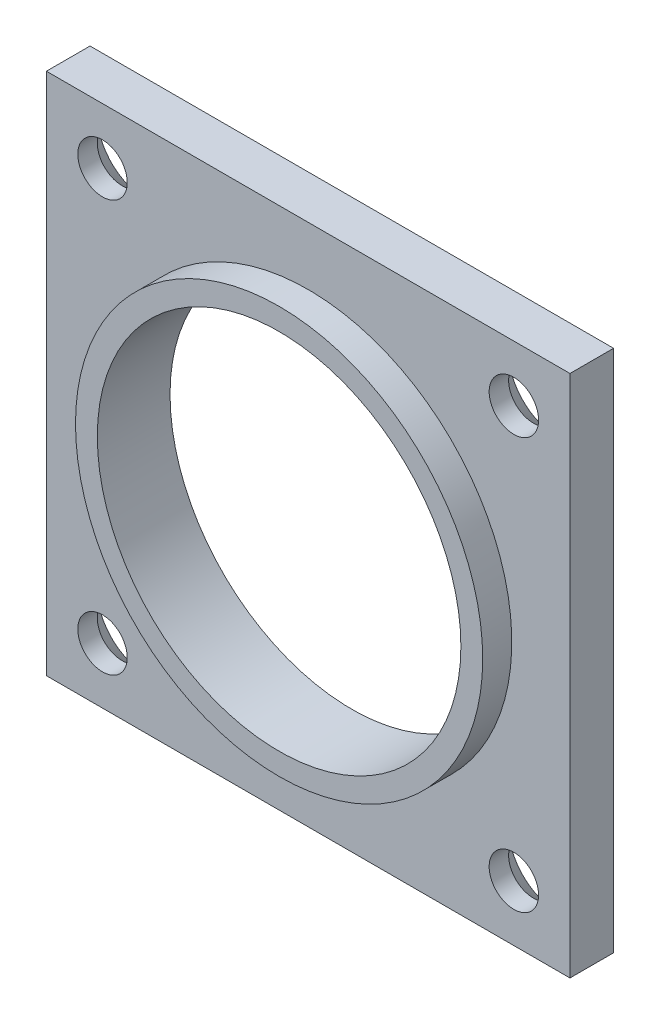
ISO-10303-21;
HEADER;
FILE_DESCRIPTION(('STEP AP214'),'2;1');
FILE_NAME('part.step','',(''),(''),'','','');
FILE_SCHEMA(('AUTOMOTIVE_DESIGN { 1 0 10303 214 1 1 1 1 }'));
ENDSEC;
DATA;
#1=APPLICATION_CONTEXT('core data for automotive mechanical design processes');
#2=APPLICATION_PROTOCOL_DEFINITION('international standard','automotive_design',2000,#1);
#3=PRODUCT_CONTEXT('',#1,'mechanical');
#4=PRODUCT('Part','Part','',(#3));
#5=PRODUCT_RELATED_PRODUCT_CATEGORY('part','',(#4));
#6=PRODUCT_DEFINITION_FORMATION('','',#4);
#7=PRODUCT_DEFINITION_CONTEXT('part definition',#1,'design');
#8=PRODUCT_DEFINITION('design','',#6,#7);
#9=PRODUCT_DEFINITION_SHAPE('','',#8);
#10=(LENGTH_UNIT() NAMED_UNIT(*) SI_UNIT(.MILLI.,.METRE.));
#11=(NAMED_UNIT(*) PLANE_ANGLE_UNIT() SI_UNIT($,.RADIAN.));
#12=(NAMED_UNIT(*) SI_UNIT($,.STERADIAN.) SOLID_ANGLE_UNIT());
#13=UNCERTAINTY_MEASURE_WITH_UNIT(LENGTH_MEASURE(1.E-05),#10,'distance_accuracy_value','');
#14=(GEOMETRIC_REPRESENTATION_CONTEXT(3) GLOBAL_UNCERTAINTY_ASSIGNED_CONTEXT((#13)) GLOBAL_UNIT_ASSIGNED_CONTEXT((#10,
#11,#12)) REPRESENTATION_CONTEXT('',''));
#15=CARTESIAN_POINT('',(0.,0.,0.));
#16=DIRECTION('',(0.,0.,1.));
#17=DIRECTION('',(1.,0.,0.));
#18=AXIS2_PLACEMENT_3D('',#15,#16,#17);
#19=CARTESIAN_POINT('',(0.,0.,3.));
#20=DIRECTION('',(0.,0.,-1.));
#21=DIRECTION('',(-1.,0.,0.));
#22=AXIS2_PLACEMENT_3D('',#19,#20,#21);
#23=PLANE('',#22);
#24=CARTESIAN_POINT('',(14.1421356237309,14.142135623731,3.));
#25=DIRECTION('',(0.,0.,-1.));
#26=DIRECTION('',(-1.,0.,0.));
#27=AXIS2_PLACEMENT_3D('',#24,#25,#26);
#28=CIRCLE('',#27,1.7);
#29=CARTESIAN_POINT('',(12.4421356237309,14.142135623731,3.));
#30=VERTEX_POINT('',#29);
#31=EDGE_CURVE('E47',#30,#30,#28,.T.);
#32=ORIENTED_EDGE('',*,*,#31,.T.);
#33=EDGE_LOOP('',(#32));
#34=FACE_BOUND('',#33,.T.);
#35=CARTESIAN_POINT('',(-14.1421356237309,14.1421356237318,3.));
#36=DIRECTION('',(0.,0.,-1.));
#37=DIRECTION('',(-1.,0.,0.));
#38=AXIS2_PLACEMENT_3D('',#35,#36,#37);
#39=CIRCLE('',#38,1.7);
#40=CARTESIAN_POINT('',(-15.8421356237309,14.1421356237318,3.));
#41=VERTEX_POINT('',#40);
#42=EDGE_CURVE('E130',#41,#41,#39,.T.);
#43=ORIENTED_EDGE('',*,*,#42,.T.);
#44=EDGE_LOOP('',(#43));
#45=FACE_BOUND('',#44,.T.);
#46=CARTESIAN_POINT('',(-14.1421356237318,-14.1421356237301,3.));
#47=DIRECTION('',(0.,0.,-1.));
#48=DIRECTION('',(-1.,0.,0.));
#49=AXIS2_PLACEMENT_3D('',#46,#47,#48);
#50=CIRCLE('',#49,1.7);
#51=CARTESIAN_POINT('',(-15.8421356237318,-14.1421356237301,3.));
#52=VERTEX_POINT('',#51);
#53=EDGE_CURVE('E126',#52,#52,#50,.T.);
#54=ORIENTED_EDGE('',*,*,#53,.T.);
#55=EDGE_LOOP('',(#54));
#56=FACE_BOUND('',#55,.T.);
#57=CARTESIAN_POINT('',(14.1421356237301,-14.1421356237309,3.));
#58=DIRECTION('',(0.,0.,-1.));
#59=DIRECTION('',(-1.,0.,0.));
#60=AXIS2_PLACEMENT_3D('',#57,#58,#59);
#61=CIRCLE('',#60,1.7);
#62=CARTESIAN_POINT('',(12.4421356237301,-14.1421356237309,3.));
#63=VERTEX_POINT('',#62);
#64=EDGE_CURVE('E121',#63,#63,#61,.T.);
#65=ORIENTED_EDGE('',*,*,#64,.T.);
#66=EDGE_LOOP('',(#65));
#67=FACE_BOUND('',#66,.T.);
#68=CARTESIAN_POINT('',(0.,0.,3.));
#69=DIRECTION('',(0.,0.,-1.));
#70=DIRECTION('',(-1.,0.,0.));
#71=AXIS2_PLACEMENT_3D('',#68,#69,#70);
#72=CIRCLE('',#71,14.);
#73=CARTESIAN_POINT('',(-14.,0.,3.));
#74=VERTEX_POINT('',#73);
#75=EDGE_CURVE('E11',#74,#74,#72,.F.);
#76=ORIENTED_EDGE('',*,*,#75,.F.);
#77=EDGE_LOOP('',(#76));
#78=FACE_BOUND('',#77,.T.);
#79=DIRECTION('',(0.,1.,0.));
#80=VECTOR('',#79,1.);
#81=CARTESIAN_POINT('',(18.,-18.,3.));
#82=LINE('',#81,#80);
#83=CARTESIAN_POINT('',(18.,-18.,3.));
#84=VERTEX_POINT('',#83);
#85=CARTESIAN_POINT('',(18.,18.,3.));
#86=VERTEX_POINT('',#85);
#87=EDGE_CURVE('E97',#84,#86,#82,.T.);
#88=ORIENTED_EDGE('',*,*,#87,.T.);
#89=DIRECTION('',(-1.,0.,0.));
#90=VECTOR('',#89,1.);
#91=CARTESIAN_POINT('',(-18.,18.,3.));
#92=LINE('',#91,#90);
#93=CARTESIAN_POINT('',(-18.,18.,3.));
#94=VERTEX_POINT('',#93);
#95=EDGE_CURVE('E93',#86,#94,#92,.T.);
#96=ORIENTED_EDGE('',*,*,#95,.T.);
#97=DIRECTION('',(0.,-1.,0.));
#98=VECTOR('',#97,1.);
#99=CARTESIAN_POINT('',(-18.,-18.,3.));
#100=LINE('',#99,#98);
#101=CARTESIAN_POINT('',(-18.,-18.,3.));
#102=VERTEX_POINT('',#101);
#103=EDGE_CURVE('E95',#94,#102,#100,.T.);
#104=ORIENTED_EDGE('',*,*,#103,.T.);
#105=DIRECTION('',(1.,0.,0.));
#106=VECTOR('',#105,1.);
#107=CARTESIAN_POINT('',(-18.,-18.,3.));
#108=LINE('',#107,#106);
#109=EDGE_CURVE('E62',#102,#84,#108,.T.);
#110=ORIENTED_EDGE('',*,*,#109,.T.);
#111=EDGE_LOOP('',(#88,#96,#104,#110));
#112=FACE_BOUND('',#111,.T.);
#113=ADVANCED_FACE('F43',(#34,#45,#56,#67,#78,#112),#23,.F.);
#114=CARTESIAN_POINT('',(0.,0.,0.));
#115=DIRECTION('',(0.,0.,-1.));
#116=DIRECTION('',(-1.,0.,0.));
#117=AXIS2_PLACEMENT_3D('',#114,#115,#116);
#118=PLANE('',#117);
#119=CARTESIAN_POINT('',(14.1421356237309,14.142135623731,0.));
#120=DIRECTION('',(0.,0.,-1.));
#121=DIRECTION('',(-1.,0.,0.));
#122=AXIS2_PLACEMENT_3D('',#119,#120,#121);
#123=CIRCLE('',#122,3.36);
#124=CARTESIAN_POINT('',(10.7821356237309,14.142135623731,0.));
#125=VERTEX_POINT('',#124);
#126=EDGE_CURVE('E376',#125,#125,#123,.T.);
#127=ORIENTED_EDGE('',*,*,#126,.F.);
#128=EDGE_LOOP('',(#127));
#129=FACE_BOUND('',#128,.T.);
#130=CARTESIAN_POINT('',(-14.1421356237309,14.1421356237318,0.));
#131=DIRECTION('',(0.,0.,-1.));
#132=DIRECTION('',(-1.,0.,0.));
#133=AXIS2_PLACEMENT_3D('',#130,#131,#132);
#134=CIRCLE('',#133,3.36);
#135=CARTESIAN_POINT('',(-17.5021356237309,14.1421356237318,0.));
#136=VERTEX_POINT('',#135);
#137=EDGE_CURVE('E139',#136,#136,#134,.T.);
#138=ORIENTED_EDGE('',*,*,#137,.F.);
#139=EDGE_LOOP('',(#138));
#140=FACE_BOUND('',#139,.T.);
#141=CARTESIAN_POINT('',(-14.1421356237318,-14.1421356237301,0.));
#142=DIRECTION('',(0.,0.,-1.));
#143=DIRECTION('',(-1.,0.,0.));
#144=AXIS2_PLACEMENT_3D('',#141,#142,#143);
#145=CIRCLE('',#144,3.36);
#146=CARTESIAN_POINT('',(-17.5021356237318,-14.1421356237301,0.));
#147=VERTEX_POINT('',#146);
#148=EDGE_CURVE('E132',#147,#147,#145,.T.);
#149=ORIENTED_EDGE('',*,*,#148,.F.);
#150=EDGE_LOOP('',(#149));
#151=FACE_BOUND('',#150,.T.);
#152=CARTESIAN_POINT('',(14.1421356237301,-14.1421356237309,0.));
#153=DIRECTION('',(0.,0.,-1.));
#154=DIRECTION('',(-1.,0.,0.));
#155=AXIS2_PLACEMENT_3D('',#152,#153,#154);
#156=CIRCLE('',#155,3.36);
#157=CARTESIAN_POINT('',(10.7821356237301,-14.1421356237309,0.));
#158=VERTEX_POINT('',#157);
#159=EDGE_CURVE('E128',#158,#158,#156,.T.);
#160=ORIENTED_EDGE('',*,*,#159,.F.);
#161=EDGE_LOOP('',(#160));
#162=FACE_BOUND('',#161,.T.);
#163=DIRECTION('',(0.,1.,0.));
#164=VECTOR('',#163,1.);
#165=CARTESIAN_POINT('',(18.,-18.,0.));
#166=LINE('',#165,#164);
#167=CARTESIAN_POINT('',(18.,-18.,0.));
#168=VERTEX_POINT('',#167);
#169=CARTESIAN_POINT('',(18.,18.,0.));
#170=VERTEX_POINT('',#169);
#171=EDGE_CURVE('E111',#168,#170,#166,.T.);
#172=ORIENTED_EDGE('',*,*,#171,.F.);
#173=DIRECTION('',(1.,0.,0.));
#174=VECTOR('',#173,1.);
#175=CARTESIAN_POINT('',(-18.,-18.,0.));
#176=LINE('',#175,#174);
#177=CARTESIAN_POINT('',(-18.,-18.,0.));
#178=VERTEX_POINT('',#177);
#179=EDGE_CURVE('E85',#178,#168,#176,.T.);
#180=ORIENTED_EDGE('',*,*,#179,.F.);
#181=DIRECTION('',(0.,-1.,0.));
#182=VECTOR('',#181,1.);
#183=CARTESIAN_POINT('',(-18.,-18.,0.));
#184=LINE('',#183,#182);
#185=CARTESIAN_POINT('',(-18.,18.,0.));
#186=VERTEX_POINT('',#185);
#187=EDGE_CURVE('E79',#186,#178,#184,.T.);
#188=ORIENTED_EDGE('',*,*,#187,.F.);
#189=DIRECTION('',(-1.,0.,0.));
#190=VECTOR('',#189,1.);
#191=CARTESIAN_POINT('',(-18.,18.,0.));
#192=LINE('',#191,#190);
#193=EDGE_CURVE('E102',#170,#186,#192,.T.);
#194=ORIENTED_EDGE('',*,*,#193,.F.);
#195=EDGE_LOOP('',(#172,#180,#188,#194));
#196=FACE_BOUND('',#195,.T.);
#197=CARTESIAN_POINT('',(0.,0.,0.));
#198=DIRECTION('',(0.,0.,1.));
#199=DIRECTION('',(1.,0.,0.));
#200=AXIS2_PLACEMENT_3D('',#197,#198,#199);
#201=CIRCLE('',#200,12.5);
#202=CARTESIAN_POINT('',(12.5,0.,0.));
#203=VERTEX_POINT('',#202);
#204=EDGE_CURVE('E114',#203,#203,#201,.T.);
#205=ORIENTED_EDGE('',*,*,#204,.T.);
#206=EDGE_LOOP('',(#205));
#207=FACE_BOUND('',#206,.T.);
#208=ADVANCED_FACE('F161',(#129,#140,#151,#162,#196,#207),#118,.T.);
#209=CARTESIAN_POINT('',(18.,-18.,3.));
#210=DIRECTION('',(-1.,0.,0.));
#211=DIRECTION('',(0.,0.,1.));
#212=AXIS2_PLACEMENT_3D('',#209,#210,#211);
#213=PLANE('',#212);
#214=ORIENTED_EDGE('',*,*,#171,.T.);
#215=DIRECTION('',(0.,0.,-1.));
#216=VECTOR('',#215,1.);
#217=CARTESIAN_POINT('',(18.,18.,3.));
#218=LINE('',#217,#216);
#219=EDGE_CURVE('E53',#86,#170,#218,.T.);
#220=ORIENTED_EDGE('',*,*,#219,.F.);
#221=ORIENTED_EDGE('',*,*,#87,.F.);
#222=DIRECTION('',(0.,0.,-1.));
#223=VECTOR('',#222,1.);
#224=CARTESIAN_POINT('',(18.,-18.,3.));
#225=LINE('',#224,#223);
#226=EDGE_CURVE('E107',#84,#168,#225,.T.);
#227=ORIENTED_EDGE('',*,*,#226,.T.);
#228=EDGE_LOOP('',(#214,#220,#221,#227));
#229=FACE_BOUND('',#228,.T.);
#230=ADVANCED_FACE('F45',(#229),#213,.F.);
#231=CARTESIAN_POINT('',(-18.,18.,3.));
#232=DIRECTION('',(0.,-1.,0.));
#233=DIRECTION('',(0.,0.,-1.));
#234=AXIS2_PLACEMENT_3D('',#231,#232,#233);
#235=PLANE('',#234);
#236=ORIENTED_EDGE('',*,*,#193,.T.);
#237=DIRECTION('',(0.,0.,-1.));
#238=VECTOR('',#237,1.);
#239=CARTESIAN_POINT('',(-18.,18.,3.));
#240=LINE('',#239,#238);
#241=EDGE_CURVE('E100',#94,#186,#240,.T.);
#242=ORIENTED_EDGE('',*,*,#241,.F.);
#243=ORIENTED_EDGE('',*,*,#95,.F.);
#244=ORIENTED_EDGE('',*,*,#219,.T.);
#245=EDGE_LOOP('',(#236,#242,#243,#244));
#246=FACE_BOUND('',#245,.T.);
#247=ADVANCED_FACE('F101',(#246),#235,.F.);
#248=CARTESIAN_POINT('',(-18.,-18.,3.));
#249=DIRECTION('',(1.,0.,0.));
#250=DIRECTION('',(0.,0.,-1.));
#251=AXIS2_PLACEMENT_3D('',#248,#249,#250);
#252=PLANE('',#251);
#253=ORIENTED_EDGE('',*,*,#187,.T.);
#254=DIRECTION('',(0.,0.,-1.));
#255=VECTOR('',#254,1.);
#256=CARTESIAN_POINT('',(-18.,-18.,3.));
#257=LINE('',#256,#255);
#258=EDGE_CURVE('E103',#102,#178,#257,.T.);
#259=ORIENTED_EDGE('',*,*,#258,.F.);
#260=ORIENTED_EDGE('',*,*,#103,.F.);
#261=ORIENTED_EDGE('',*,*,#241,.T.);
#262=EDGE_LOOP('',(#253,#259,#260,#261));
#263=FACE_BOUND('',#262,.T.);
#264=ADVANCED_FACE('F105',(#263),#252,.F.);
#265=CARTESIAN_POINT('',(-18.,-18.,3.));
#266=DIRECTION('',(0.,1.,0.));
#267=DIRECTION('',(0.,0.,1.));
#268=AXIS2_PLACEMENT_3D('',#265,#266,#267);
#269=PLANE('',#268);
#270=ORIENTED_EDGE('',*,*,#179,.T.);
#271=ORIENTED_EDGE('',*,*,#226,.F.);
#272=ORIENTED_EDGE('',*,*,#109,.F.);
#273=ORIENTED_EDGE('',*,*,#258,.T.);
#274=EDGE_LOOP('',(#270,#271,#272,#273));
#275=FACE_BOUND('',#274,.T.);
#276=ADVANCED_FACE('F167',(#275),#269,.F.);
#277=CARTESIAN_POINT('',(0.,0.,3.));
#278=DIRECTION('',(0.,0.,-1.));
#279=DIRECTION('',(-1.,0.,0.));
#280=AXIS2_PLACEMENT_3D('',#277,#278,#279);
#281=CYLINDRICAL_SURFACE('',#280,12.5);
#282=ORIENTED_EDGE('',*,*,#204,.F.);
#283=EDGE_LOOP('',(#282));
#284=FACE_BOUND('',#283,.T.);
#285=CARTESIAN_POINT('',(0.,0.,5.));
#286=DIRECTION('',(0.,0.,1.));
#287=DIRECTION('',(1.,0.,0.));
#288=AXIS2_PLACEMENT_3D('',#285,#286,#287);
#289=CIRCLE('',#288,12.5);
#290=CARTESIAN_POINT('',(12.5,0.,5.));
#291=VERTEX_POINT('',#290);
#292=EDGE_CURVE('E124',#291,#291,#289,.F.);
#293=ORIENTED_EDGE('',*,*,#292,.F.);
#294=EDGE_LOOP('',(#293));
#295=FACE_BOUND('',#294,.T.);
#296=ADVANCED_FACE('F163',(#284,#295),#281,.F.);
#297=CARTESIAN_POINT('',(0.,0.,5.));
#298=DIRECTION('',(0.,0.,-1.));
#299=DIRECTION('',(-1.,0.,0.));
#300=AXIS2_PLACEMENT_3D('',#297,#298,#299);
#301=CYLINDRICAL_SURFACE('',#300,14.);
#302=CARTESIAN_POINT('',(0.,0.,5.));
#303=DIRECTION('',(0.,0.,1.));
#304=DIRECTION('',(1.,0.,0.));
#305=AXIS2_PLACEMENT_3D('',#302,#303,#304);
#306=CIRCLE('',#305,14.);
#307=CARTESIAN_POINT('',(14.,0.,5.));
#308=VERTEX_POINT('',#307);
#309=EDGE_CURVE('E155',#308,#308,#306,.T.);
#310=ORIENTED_EDGE('',*,*,#309,.F.);
#311=EDGE_LOOP('',(#310));
#312=FACE_BOUND('',#311,.T.);
#313=ORIENTED_EDGE('',*,*,#75,.T.);
#314=EDGE_LOOP('',(#313));
#315=FACE_BOUND('',#314,.T.);
#316=ADVANCED_FACE('F166',(#312,#315),#301,.T.);
#317=CARTESIAN_POINT('',(0.,0.,5.));
#318=DIRECTION('',(0.,0.,1.));
#319=DIRECTION('',(1.,0.,0.));
#320=AXIS2_PLACEMENT_3D('',#317,#318,#319);
#321=PLANE('',#320);
#322=ORIENTED_EDGE('',*,*,#292,.T.);
#323=EDGE_LOOP('',(#322));
#324=FACE_BOUND('',#323,.T.);
#325=ORIENTED_EDGE('',*,*,#309,.T.);
#326=EDGE_LOOP('',(#325));
#327=FACE_BOUND('',#326,.T.);
#328=ADVANCED_FACE('F171',(#324,#327),#321,.T.);
#329=CARTESIAN_POINT('',(14.1421356237301,-14.1421356237309,0.));
#330=DIRECTION('',(0.,0.,-1.));
#331=DIRECTION('',(-1.,0.,0.));
#332=AXIS2_PLACEMENT_3D('',#329,#330,#331);
#333=CYLINDRICAL_SURFACE('',#332,1.7);
#334=CARTESIAN_POINT('',(14.1421356237301,-14.1421356237309,1.66));
#335=DIRECTION('',(0.,0.,-1.));
#336=DIRECTION('',(-1.,0.,0.));
#337=AXIS2_PLACEMENT_3D('',#334,#335,#336);
#338=CIRCLE('',#337,1.7);
#339=CARTESIAN_POINT('',(12.4421356237301,-14.1421356237309,1.66));
#340=VERTEX_POINT('',#339);
#341=EDGE_CURVE('E125',#340,#340,#338,.T.);
#342=ORIENTED_EDGE('',*,*,#341,.T.);
#343=EDGE_LOOP('',(#342));
#344=FACE_BOUND('',#343,.T.);
#345=ORIENTED_EDGE('',*,*,#64,.F.);
#346=EDGE_LOOP('',(#345));
#347=FACE_BOUND('',#346,.T.);
#348=ADVANCED_FACE('F174',(#344,#347),#333,.F.);
#349=CARTESIAN_POINT('',(14.1421356237301,-14.1421356237309,0.));
#350=DIRECTION('',(0.,0.,-1.));
#351=DIRECTION('',(-1.,0.,0.));
#352=AXIS2_PLACEMENT_3D('',#349,#350,#351);
#353=CONICAL_SURFACE('',#352,3.36,0.785398163397449);
#354=ORIENTED_EDGE('',*,*,#341,.F.);
#355=EDGE_LOOP('',(#354));
#356=FACE_BOUND('',#355,.T.);
#357=ORIENTED_EDGE('',*,*,#159,.T.);
#358=EDGE_LOOP('',(#357));
#359=FACE_BOUND('',#358,.T.);
#360=ADVANCED_FACE('F224',(#356,#359),#353,.F.);
#361=CARTESIAN_POINT('',(-14.1421356237318,-14.1421356237301,0.));
#362=DIRECTION('',(0.,0.,-1.));
#363=DIRECTION('',(-1.,0.,0.));
#364=AXIS2_PLACEMENT_3D('',#361,#362,#363);
#365=CYLINDRICAL_SURFACE('',#364,1.7);
#366=CARTESIAN_POINT('',(-14.1421356237318,-14.1421356237301,1.66));
#367=DIRECTION('',(0.,0.,-1.));
#368=DIRECTION('',(-1.,0.,0.));
#369=AXIS2_PLACEMENT_3D('',#366,#367,#368);
#370=CIRCLE('',#369,1.7);
#371=CARTESIAN_POINT('',(-15.8421356237318,-14.1421356237301,1.66));
#372=VERTEX_POINT('',#371);
#373=EDGE_CURVE('E129',#372,#372,#370,.T.);
#374=ORIENTED_EDGE('',*,*,#373,.T.);
#375=EDGE_LOOP('',(#374));
#376=FACE_BOUND('',#375,.T.);
#377=ORIENTED_EDGE('',*,*,#53,.F.);
#378=EDGE_LOOP('',(#377));
#379=FACE_BOUND('',#378,.T.);
#380=ADVANCED_FACE('F236',(#376,#379),#365,.F.);
#381=CARTESIAN_POINT('',(-14.1421356237318,-14.1421356237301,0.));
#382=DIRECTION('',(0.,0.,-1.));
#383=DIRECTION('',(-1.,0.,0.));
#384=AXIS2_PLACEMENT_3D('',#381,#382,#383);
#385=CONICAL_SURFACE('',#384,3.36,0.785398163397449);
#386=ORIENTED_EDGE('',*,*,#373,.F.);
#387=EDGE_LOOP('',(#386));
#388=FACE_BOUND('',#387,.T.);
#389=ORIENTED_EDGE('',*,*,#148,.T.);
#390=EDGE_LOOP('',(#389));
#391=FACE_BOUND('',#390,.T.);
#392=ADVANCED_FACE('F247',(#388,#391),#385,.F.);
#393=CARTESIAN_POINT('',(-14.1421356237309,14.1421356237318,0.));
#394=DIRECTION('',(0.,0.,-1.));
#395=DIRECTION('',(-1.,0.,0.));
#396=AXIS2_PLACEMENT_3D('',#393,#394,#395);
#397=CYLINDRICAL_SURFACE('',#396,1.7);
#398=CARTESIAN_POINT('',(-14.1421356237309,14.1421356237318,1.66));
#399=DIRECTION('',(0.,0.,-1.));
#400=DIRECTION('',(-1.,0.,0.));
#401=AXIS2_PLACEMENT_3D('',#398,#399,#400);
#402=CIRCLE('',#401,1.7);
#403=CARTESIAN_POINT('',(-15.8421356237309,14.1421356237318,1.66));
#404=VERTEX_POINT('',#403);
#405=EDGE_CURVE('E133',#404,#404,#402,.T.);
#406=ORIENTED_EDGE('',*,*,#405,.T.);
#407=EDGE_LOOP('',(#406));
#408=FACE_BOUND('',#407,.T.);
#409=ORIENTED_EDGE('',*,*,#42,.F.);
#410=EDGE_LOOP('',(#409));
#411=FACE_BOUND('',#410,.T.);
#412=ADVANCED_FACE('F258',(#408,#411),#397,.F.);
#413=CARTESIAN_POINT('',(-14.1421356237309,14.1421356237318,0.));
#414=DIRECTION('',(0.,0.,-1.));
#415=DIRECTION('',(-1.,0.,0.));
#416=AXIS2_PLACEMENT_3D('',#413,#414,#415);
#417=CONICAL_SURFACE('',#416,3.36,0.785398163397449);
#418=ORIENTED_EDGE('',*,*,#405,.F.);
#419=EDGE_LOOP('',(#418));
#420=FACE_BOUND('',#419,.T.);
#421=ORIENTED_EDGE('',*,*,#137,.T.);
#422=EDGE_LOOP('',(#421));
#423=FACE_BOUND('',#422,.T.);
#424=ADVANCED_FACE('F269',(#420,#423),#417,.F.);
#425=CARTESIAN_POINT('',(14.1421356237309,14.142135623731,0.));
#426=DIRECTION('',(0.,0.,-1.));
#427=DIRECTION('',(-1.,0.,0.));
#428=AXIS2_PLACEMENT_3D('',#425,#426,#427);
#429=CYLINDRICAL_SURFACE('',#428,1.7);
#430=CARTESIAN_POINT('',(14.1421356237309,14.142135623731,1.66));
#431=DIRECTION('',(0.,0.,-1.));
#432=DIRECTION('',(-1.,0.,0.));
#433=AXIS2_PLACEMENT_3D('',#430,#431,#432);
#434=CIRCLE('',#433,1.7);
#435=CARTESIAN_POINT('',(12.4421356237309,14.142135623731,1.66));
#436=VERTEX_POINT('',#435);
#437=EDGE_CURVE('E373',#436,#436,#434,.T.);
#438=ORIENTED_EDGE('',*,*,#437,.T.);
#439=EDGE_LOOP('',(#438));
#440=FACE_BOUND('',#439,.T.);
#441=ORIENTED_EDGE('',*,*,#31,.F.);
#442=EDGE_LOOP('',(#441));
#443=FACE_BOUND('',#442,.T.);
#444=ADVANCED_FACE('F279',(#440,#443),#429,.F.);
#445=CARTESIAN_POINT('',(14.1421356237309,14.142135623731,0.));
#446=DIRECTION('',(0.,0.,-1.));
#447=DIRECTION('',(-1.,0.,0.));
#448=AXIS2_PLACEMENT_3D('',#445,#446,#447);
#449=CONICAL_SURFACE('',#448,3.36,0.785398163397449);
#450=ORIENTED_EDGE('',*,*,#437,.F.);
#451=EDGE_LOOP('',(#450));
#452=FACE_BOUND('',#451,.T.);
#453=ORIENTED_EDGE('',*,*,#126,.T.);
#454=EDGE_LOOP('',(#453));
#455=FACE_BOUND('',#454,.T.);
#456=ADVANCED_FACE('F290',(#452,#455),#449,.F.);
#457=CLOSED_SHELL('',(#113,#208,#230,#247,#264,#276,#296,#316,#328,#348,#360,#380,#392,#412,
#424,#444,#456));
#458=MANIFOLD_SOLID_BREP('B2',#457);
#459=ADVANCED_BREP_SHAPE_REPRESENTATION('',(#18,#458),#14);
#460=SHAPE_DEFINITION_REPRESENTATION(#9,#459);
ENDSEC;
END-ISO-10303-21;
